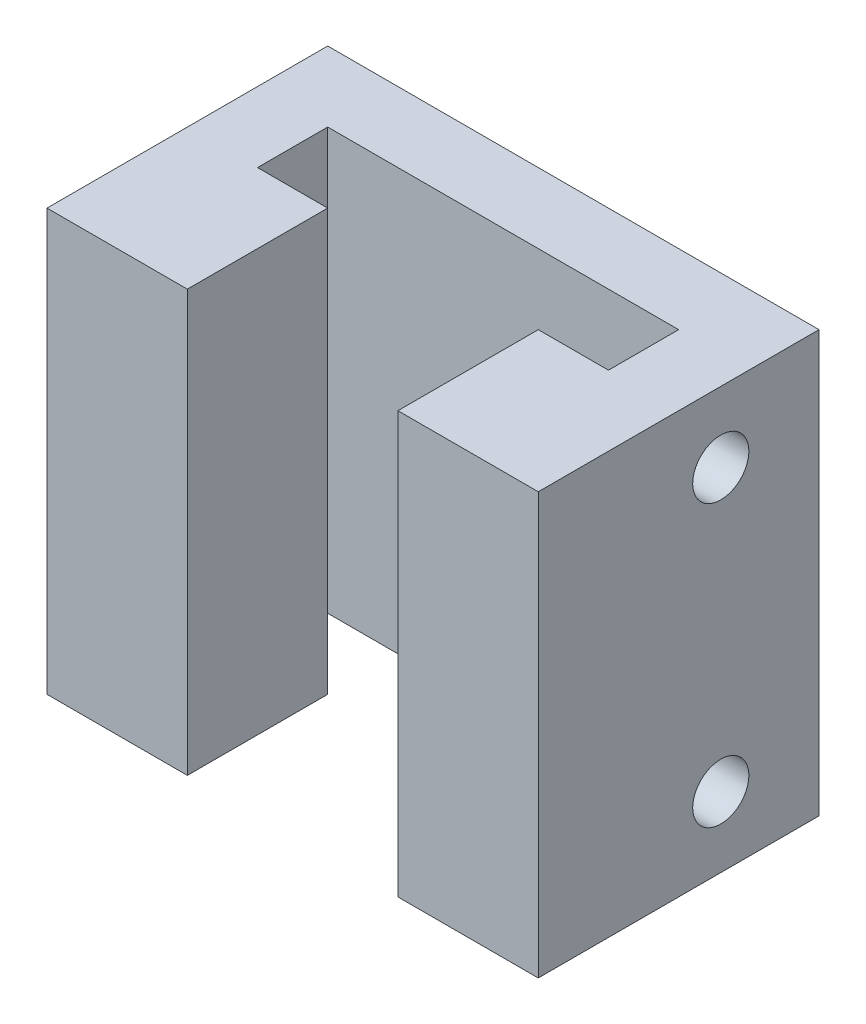
ISO-10303-21;
HEADER;
FILE_DESCRIPTION(('STEP AP214'),'2;1');
FILE_NAME('part.step','',(''),(''),'','','');
FILE_SCHEMA(('AUTOMOTIVE_DESIGN { 1 0 10303 214 1 1 1 1 }'));
ENDSEC;
DATA;
#1=APPLICATION_CONTEXT('core data for automotive mechanical design processes');
#2=APPLICATION_PROTOCOL_DEFINITION('international standard','automotive_design',2000,#1);
#3=PRODUCT_CONTEXT('',#1,'mechanical');
#4=PRODUCT('Part','Part','',(#3));
#5=PRODUCT_RELATED_PRODUCT_CATEGORY('part','',(#4));
#6=PRODUCT_DEFINITION_FORMATION('','',#4);
#7=PRODUCT_DEFINITION_CONTEXT('part definition',#1,'design');
#8=PRODUCT_DEFINITION('design','',#6,#7);
#9=PRODUCT_DEFINITION_SHAPE('','',#8);
#10=(LENGTH_UNIT() NAMED_UNIT(*) SI_UNIT(.MILLI.,.METRE.));
#11=(NAMED_UNIT(*) PLANE_ANGLE_UNIT() SI_UNIT($,.RADIAN.));
#12=(NAMED_UNIT(*) SI_UNIT($,.STERADIAN.) SOLID_ANGLE_UNIT());
#13=UNCERTAINTY_MEASURE_WITH_UNIT(LENGTH_MEASURE(1.E-05),#10,'distance_accuracy_value','');
#14=(GEOMETRIC_REPRESENTATION_CONTEXT(3) GLOBAL_UNCERTAINTY_ASSIGNED_CONTEXT((#13)) GLOBAL_UNIT_ASSIGNED_CONTEXT((#10,
#11,#12)) REPRESENTATION_CONTEXT('',''));
#15=CARTESIAN_POINT('',(0.,0.,0.));
#16=DIRECTION('',(0.,0.,1.));
#17=DIRECTION('',(1.,0.,0.));
#18=AXIS2_PLACEMENT_3D('',#15,#16,#17);
#19=CARTESIAN_POINT('',(0.,30.,-10.));
#20=DIRECTION('',(-1.,0.,0.));
#21=DIRECTION('',(0.,0.,1.));
#22=AXIS2_PLACEMENT_3D('',#19,#20,#21);
#23=PLANE('',#22);
#24=DIRECTION('',(0.,0.,-1.));
#25=VECTOR('',#24,1.);
#26=CARTESIAN_POINT('',(0.,0.,-10.));
#27=LINE('',#26,#25);
#28=CARTESIAN_POINT('',(0.,0.,0.));
#29=VERTEX_POINT('',#28);
#30=CARTESIAN_POINT('',(0.,0.,-10.));
#31=VERTEX_POINT('',#30);
#32=EDGE_CURVE('E158',#29,#31,#27,.T.);
#33=ORIENTED_EDGE('',*,*,#32,.T.);
#34=DIRECTION('',(0.,-1.,0.));
#35=VECTOR('',#34,1.);
#36=CARTESIAN_POINT('',(0.,30.,-10.));
#37=LINE('',#36,#35);
#38=CARTESIAN_POINT('',(0.,30.,-10.));
#39=VERTEX_POINT('',#38);
#40=EDGE_CURVE('E11',#39,#31,#37,.T.);
#41=ORIENTED_EDGE('',*,*,#40,.F.);
#42=DIRECTION('',(0.,0.,-1.));
#43=VECTOR('',#42,1.);
#44=CARTESIAN_POINT('',(0.,30.,-10.));
#45=LINE('',#44,#43);
#46=CARTESIAN_POINT('',(0.,30.,0.));
#47=VERTEX_POINT('',#46);
#48=EDGE_CURVE('E181',#47,#39,#45,.T.);
#49=ORIENTED_EDGE('',*,*,#48,.F.);
#50=DIRECTION('',(0.,-1.,0.));
#51=VECTOR('',#50,1.);
#52=CARTESIAN_POINT('',(0.,30.,0.));
#53=LINE('',#52,#51);
#54=EDGE_CURVE('E154',#47,#29,#53,.T.);
#55=ORIENTED_EDGE('',*,*,#54,.T.);
#56=EDGE_LOOP('',(#33,#41,#49,#55));
#57=FACE_BOUND('',#56,.T.);
#58=ADVANCED_FACE('F38',(#57),#23,.F.);
#59=CARTESIAN_POINT('',(0.,30.,-10.));
#60=DIRECTION('',(0.,0.,1.));
#61=DIRECTION('',(1.,0.,0.));
#62=AXIS2_PLACEMENT_3D('',#59,#60,#61);
#63=PLANE('',#62);
#64=DIRECTION('',(-1.,0.,0.));
#65=VECTOR('',#64,1.);
#66=CARTESIAN_POINT('',(0.,0.,-10.));
#67=LINE('',#66,#65);
#68=CARTESIAN_POINT('',(-5.,0.,-10.));
#69=VERTEX_POINT('',#68);
#70=EDGE_CURVE('E161',#31,#69,#67,.T.);
#71=ORIENTED_EDGE('',*,*,#70,.T.);
#72=DIRECTION('',(0.,-1.,0.));
#73=VECTOR('',#72,1.);
#74=CARTESIAN_POINT('',(-5.,30.,-10.));
#75=LINE('',#74,#73);
#76=CARTESIAN_POINT('',(-5.,30.,-10.));
#77=VERTEX_POINT('',#76);
#78=EDGE_CURVE('E46',#77,#69,#75,.T.);
#79=ORIENTED_EDGE('',*,*,#78,.F.);
#80=DIRECTION('',(-1.,0.,0.));
#81=VECTOR('',#80,1.);
#82=CARTESIAN_POINT('',(0.,30.,-10.));
#83=LINE('',#82,#81);
#84=EDGE_CURVE('E109',#39,#77,#83,.T.);
#85=ORIENTED_EDGE('',*,*,#84,.F.);
#86=ORIENTED_EDGE('',*,*,#40,.T.);
#87=EDGE_LOOP('',(#71,#79,#85,#86));
#88=FACE_BOUND('',#87,.T.);
#89=ADVANCED_FACE('F261',(#88),#63,.F.);
#90=CARTESIAN_POINT('',(-5.,30.,-10.));
#91=DIRECTION('',(-1.,0.,0.));
#92=DIRECTION('',(0.,0.,1.));
#93=AXIS2_PLACEMENT_3D('',#90,#91,#92);
#94=PLANE('',#93);
#95=DIRECTION('',(0.,0.,-1.));
#96=VECTOR('',#95,1.);
#97=CARTESIAN_POINT('',(-5.,0.,-10.));
#98=LINE('',#97,#96);
#99=CARTESIAN_POINT('',(-5.,0.,-15.));
#100=VERTEX_POINT('',#99);
#101=EDGE_CURVE('E164',#69,#100,#98,.T.);
#102=ORIENTED_EDGE('',*,*,#101,.T.);
#103=DIRECTION('',(0.,-1.,0.));
#104=VECTOR('',#103,1.);
#105=CARTESIAN_POINT('',(-5.,30.,-15.));
#106=LINE('',#105,#104);
#107=CARTESIAN_POINT('',(-5.,30.,-15.));
#108=VERTEX_POINT('',#107);
#109=EDGE_CURVE('E200',#108,#100,#106,.T.);
#110=ORIENTED_EDGE('',*,*,#109,.F.);
#111=DIRECTION('',(0.,0.,-1.));
#112=VECTOR('',#111,1.);
#113=CARTESIAN_POINT('',(-5.,30.,-10.));
#114=LINE('',#113,#112);
#115=EDGE_CURVE('E208',#77,#108,#114,.T.);
#116=ORIENTED_EDGE('',*,*,#115,.F.);
#117=ORIENTED_EDGE('',*,*,#78,.T.);
#118=EDGE_LOOP('',(#102,#110,#116,#117));
#119=FACE_BOUND('',#118,.T.);
#120=ADVANCED_FACE('F206',(#119),#94,.F.);
#121=CARTESIAN_POINT('',(-5.,30.,-15.));
#122=DIRECTION('',(0.,0.,-1.));
#123=DIRECTION('',(-1.,0.,0.));
#124=AXIS2_PLACEMENT_3D('',#121,#122,#123);
#125=PLANE('',#124);
#126=DIRECTION('',(1.,0.,0.));
#127=VECTOR('',#126,1.);
#128=CARTESIAN_POINT('',(-5.,0.,-15.));
#129=LINE('',#128,#127);
#130=CARTESIAN_POINT('',(20.,0.,-15.));
#131=VERTEX_POINT('',#130);
#132=EDGE_CURVE('E166',#100,#131,#129,.T.);
#133=ORIENTED_EDGE('',*,*,#132,.T.);
#134=DIRECTION('',(0.,-1.,0.));
#135=VECTOR('',#134,1.);
#136=CARTESIAN_POINT('',(20.,30.,-15.));
#137=LINE('',#136,#135);
#138=CARTESIAN_POINT('',(20.,30.,-15.));
#139=VERTEX_POINT('',#138);
#140=EDGE_CURVE('E197',#139,#131,#137,.T.);
#141=ORIENTED_EDGE('',*,*,#140,.F.);
#142=DIRECTION('',(1.,0.,0.));
#143=VECTOR('',#142,1.);
#144=CARTESIAN_POINT('',(-5.,30.,-15.));
#145=LINE('',#144,#143);
#146=EDGE_CURVE('E226',#108,#139,#145,.T.);
#147=ORIENTED_EDGE('',*,*,#146,.F.);
#148=ORIENTED_EDGE('',*,*,#109,.T.);
#149=EDGE_LOOP('',(#133,#141,#147,#148));
#150=FACE_BOUND('',#149,.T.);
#151=ADVANCED_FACE('F217',(#150),#125,.F.);
#152=CARTESIAN_POINT('',(20.,30.,-15.));
#153=DIRECTION('',(1.,0.,0.));
#154=DIRECTION('',(0.,0.,-1.));
#155=AXIS2_PLACEMENT_3D('',#152,#153,#154);
#156=PLANE('',#155);
#157=DIRECTION('',(0.,0.,1.));
#158=VECTOR('',#157,1.);
#159=CARTESIAN_POINT('',(20.,0.,-15.));
#160=LINE('',#159,#158);
#161=CARTESIAN_POINT('',(20.,0.,-10.));
#162=VERTEX_POINT('',#161);
#163=EDGE_CURVE('E168',#131,#162,#160,.T.);
#164=ORIENTED_EDGE('',*,*,#163,.T.);
#165=DIRECTION('',(0.,-1.,0.));
#166=VECTOR('',#165,1.);
#167=CARTESIAN_POINT('',(20.,30.,-10.));
#168=LINE('',#167,#166);
#169=CARTESIAN_POINT('',(20.,30.,-10.));
#170=VERTEX_POINT('',#169);
#171=EDGE_CURVE('E194',#170,#162,#168,.T.);
#172=ORIENTED_EDGE('',*,*,#171,.F.);
#173=DIRECTION('',(0.,0.,1.));
#174=VECTOR('',#173,1.);
#175=CARTESIAN_POINT('',(20.,30.,-15.));
#176=LINE('',#175,#174);
#177=EDGE_CURVE('E223',#139,#170,#176,.T.);
#178=ORIENTED_EDGE('',*,*,#177,.F.);
#179=ORIENTED_EDGE('',*,*,#140,.T.);
#180=EDGE_LOOP('',(#164,#172,#178,#179));
#181=FACE_BOUND('',#180,.T.);
#182=ADVANCED_FACE('F221',(#181),#156,.F.);
#183=CARTESIAN_POINT('',(20.,30.,-10.));
#184=DIRECTION('',(0.,0.,1.));
#185=DIRECTION('',(1.,0.,0.));
#186=AXIS2_PLACEMENT_3D('',#183,#184,#185);
#187=PLANE('',#186);
#188=DIRECTION('',(-1.,0.,0.));
#189=VECTOR('',#188,1.);
#190=CARTESIAN_POINT('',(20.,0.,-10.));
#191=LINE('',#190,#189);
#192=CARTESIAN_POINT('',(15.,0.,-10.));
#193=VERTEX_POINT('',#192);
#194=EDGE_CURVE('E170',#162,#193,#191,.T.);
#195=ORIENTED_EDGE('',*,*,#194,.T.);
#196=DIRECTION('',(0.,-1.,0.));
#197=VECTOR('',#196,1.);
#198=CARTESIAN_POINT('',(15.,30.,-10.));
#199=LINE('',#198,#197);
#200=CARTESIAN_POINT('',(15.,30.,-10.));
#201=VERTEX_POINT('',#200);
#202=EDGE_CURVE('E191',#201,#193,#199,.T.);
#203=ORIENTED_EDGE('',*,*,#202,.F.);
#204=DIRECTION('',(-1.,0.,0.));
#205=VECTOR('',#204,1.);
#206=CARTESIAN_POINT('',(20.,30.,-10.));
#207=LINE('',#206,#205);
#208=EDGE_CURVE('E225',#170,#201,#207,.T.);
#209=ORIENTED_EDGE('',*,*,#208,.F.);
#210=ORIENTED_EDGE('',*,*,#171,.T.);
#211=EDGE_LOOP('',(#195,#203,#209,#210));
#212=FACE_BOUND('',#211,.T.);
#213=ADVANCED_FACE('F274',(#212),#187,.F.);
#214=CARTESIAN_POINT('',(15.,30.,0.));
#215=DIRECTION('',(1.,0.,0.));
#216=DIRECTION('',(0.,0.,-1.));
#217=AXIS2_PLACEMENT_3D('',#214,#215,#216);
#218=PLANE('',#217);
#219=DIRECTION('',(0.,0.,1.));
#220=VECTOR('',#219,1.);
#221=CARTESIAN_POINT('',(15.,0.,0.));
#222=LINE('',#221,#220);
#223=CARTESIAN_POINT('',(15.,0.,0.));
#224=VERTEX_POINT('',#223);
#225=EDGE_CURVE('E172',#193,#224,#222,.T.);
#226=ORIENTED_EDGE('',*,*,#225,.T.);
#227=DIRECTION('',(0.,-1.,0.));
#228=VECTOR('',#227,1.);
#229=CARTESIAN_POINT('',(15.,30.,0.));
#230=LINE('',#229,#228);
#231=CARTESIAN_POINT('',(15.,30.,0.));
#232=VERTEX_POINT('',#231);
#233=EDGE_CURVE('E188',#232,#224,#230,.T.);
#234=ORIENTED_EDGE('',*,*,#233,.F.);
#235=DIRECTION('',(0.,0.,1.));
#236=VECTOR('',#235,1.);
#237=CARTESIAN_POINT('',(15.,30.,0.));
#238=LINE('',#237,#236);
#239=EDGE_CURVE('E228',#201,#232,#238,.T.);
#240=ORIENTED_EDGE('',*,*,#239,.F.);
#241=ORIENTED_EDGE('',*,*,#202,.T.);
#242=EDGE_LOOP('',(#226,#234,#240,#241));
#243=FACE_BOUND('',#242,.T.);
#244=ADVANCED_FACE('F277',(#243),#218,.F.);
#245=CARTESIAN_POINT('',(25.,30.,0.));
#246=DIRECTION('',(0.,0.,-1.));
#247=DIRECTION('',(-1.,0.,0.));
#248=AXIS2_PLACEMENT_3D('',#245,#246,#247);
#249=PLANE('',#248);
#250=DIRECTION('',(1.,0.,0.));
#251=VECTOR('',#250,1.);
#252=CARTESIAN_POINT('',(25.,0.,0.));
#253=LINE('',#252,#251);
#254=CARTESIAN_POINT('',(25.,0.,0.));
#255=VERTEX_POINT('',#254);
#256=EDGE_CURVE('E174',#224,#255,#253,.T.);
#257=ORIENTED_EDGE('',*,*,#256,.T.);
#258=DIRECTION('',(0.,-1.,0.));
#259=VECTOR('',#258,1.);
#260=CARTESIAN_POINT('',(25.,30.,0.));
#261=LINE('',#260,#259);
#262=CARTESIAN_POINT('',(25.,30.,0.));
#263=VERTEX_POINT('',#262);
#264=EDGE_CURVE('E185',#263,#255,#261,.T.);
#265=ORIENTED_EDGE('',*,*,#264,.F.);
#266=DIRECTION('',(1.,0.,0.));
#267=VECTOR('',#266,1.);
#268=CARTESIAN_POINT('',(25.,30.,0.));
#269=LINE('',#268,#267);
#270=EDGE_CURVE('E234',#232,#263,#269,.T.);
#271=ORIENTED_EDGE('',*,*,#270,.F.);
#272=ORIENTED_EDGE('',*,*,#233,.T.);
#273=EDGE_LOOP('',(#257,#265,#271,#272));
#274=FACE_BOUND('',#273,.T.);
#275=ADVANCED_FACE('F240',(#274),#249,.F.);
#276=CARTESIAN_POINT('',(25.,30.,-20.));
#277=DIRECTION('',(-1.,0.,0.));
#278=DIRECTION('',(0.,0.,1.));
#279=AXIS2_PLACEMENT_3D('',#276,#277,#278);
#280=PLANE('',#279);
#281=CARTESIAN_POINT('',(25.,25.,-13.));
#282=DIRECTION('',(-1.,0.,0.));
#283=DIRECTION('',(0.,0.,1.));
#284=AXIS2_PLACEMENT_3D('',#281,#282,#283);
#285=CIRCLE('',#284,2.);
#286=CARTESIAN_POINT('',(25.,25.,-11.));
#287=VERTEX_POINT('',#286);
#288=EDGE_CURVE('E466',#287,#287,#285,.T.);
#289=ORIENTED_EDGE('',*,*,#288,.T.);
#290=EDGE_LOOP('',(#289));
#291=FACE_BOUND('',#290,.T.);
#292=CARTESIAN_POINT('',(25.,5.,-13.));
#293=DIRECTION('',(-1.,0.,0.));
#294=DIRECTION('',(0.,0.,1.));
#295=AXIS2_PLACEMENT_3D('',#292,#293,#294);
#296=CIRCLE('',#295,2.);
#297=CARTESIAN_POINT('',(25.,5.,-11.));
#298=VERTEX_POINT('',#297);
#299=EDGE_CURVE('E453',#298,#298,#296,.T.);
#300=ORIENTED_EDGE('',*,*,#299,.T.);
#301=EDGE_LOOP('',(#300));
#302=FACE_BOUND('',#301,.T.);
#303=DIRECTION('',(0.,0.,-1.));
#304=VECTOR('',#303,1.);
#305=CARTESIAN_POINT('',(25.,0.,-20.));
#306=LINE('',#305,#304);
#307=CARTESIAN_POINT('',(25.,0.,-20.));
#308=VERTEX_POINT('',#307);
#309=EDGE_CURVE('E176',#255,#308,#306,.T.);
#310=ORIENTED_EDGE('',*,*,#309,.T.);
#311=DIRECTION('',(0.,-1.,0.));
#312=VECTOR('',#311,1.);
#313=CARTESIAN_POINT('',(25.,30.,-20.));
#314=LINE('',#313,#312);
#315=CARTESIAN_POINT('',(25.,30.,-20.));
#316=VERTEX_POINT('',#315);
#317=EDGE_CURVE('E149',#316,#308,#314,.T.);
#318=ORIENTED_EDGE('',*,*,#317,.F.);
#319=DIRECTION('',(0.,0.,-1.));
#320=VECTOR('',#319,1.);
#321=CARTESIAN_POINT('',(25.,30.,-20.));
#322=LINE('',#321,#320);
#323=EDGE_CURVE('E140',#263,#316,#322,.T.);
#324=ORIENTED_EDGE('',*,*,#323,.F.);
#325=ORIENTED_EDGE('',*,*,#264,.T.);
#326=EDGE_LOOP('',(#310,#318,#324,#325));
#327=FACE_BOUND('',#326,.T.);
#328=ADVANCED_FACE('F244',(#291,#302,#327),#280,.F.);
#329=CARTESIAN_POINT('',(-10.,30.,-20.));
#330=DIRECTION('',(0.,0.,1.));
#331=DIRECTION('',(1.,0.,0.));
#332=AXIS2_PLACEMENT_3D('',#329,#330,#331);
#333=PLANE('',#332);
#334=DIRECTION('',(-1.,0.,0.));
#335=VECTOR('',#334,1.);
#336=CARTESIAN_POINT('',(-10.,0.,-20.));
#337=LINE('',#336,#335);
#338=CARTESIAN_POINT('',(-10.,0.,-20.));
#339=VERTEX_POINT('',#338);
#340=EDGE_CURVE('E148',#308,#339,#337,.T.);
#341=ORIENTED_EDGE('',*,*,#340,.T.);
#342=DIRECTION('',(0.,-1.,0.));
#343=VECTOR('',#342,1.);
#344=CARTESIAN_POINT('',(-10.,30.,-20.));
#345=LINE('',#344,#343);
#346=CARTESIAN_POINT('',(-10.,30.,-20.));
#347=VERTEX_POINT('',#346);
#348=EDGE_CURVE('E145',#347,#339,#345,.T.);
#349=ORIENTED_EDGE('',*,*,#348,.F.);
#350=DIRECTION('',(-1.,0.,0.));
#351=VECTOR('',#350,1.);
#352=CARTESIAN_POINT('',(-10.,30.,-20.));
#353=LINE('',#352,#351);
#354=EDGE_CURVE('E134',#316,#347,#353,.T.);
#355=ORIENTED_EDGE('',*,*,#354,.F.);
#356=ORIENTED_EDGE('',*,*,#317,.T.);
#357=EDGE_LOOP('',(#341,#349,#355,#356));
#358=FACE_BOUND('',#357,.T.);
#359=ADVANCED_FACE('F146',(#358),#333,.F.);
#360=CARTESIAN_POINT('',(-10.,30.,0.));
#361=DIRECTION('',(1.,0.,0.));
#362=DIRECTION('',(0.,0.,-1.));
#363=AXIS2_PLACEMENT_3D('',#360,#361,#362);
#364=PLANE('',#363);
#365=CARTESIAN_POINT('',(-10.,25.,-13.));
#366=DIRECTION('',(-1.,0.,0.));
#367=DIRECTION('',(0.,0.,1.));
#368=AXIS2_PLACEMENT_3D('',#365,#366,#367);
#369=CIRCLE('',#368,2.);
#370=CARTESIAN_POINT('',(-10.,25.,-11.));
#371=VERTEX_POINT('',#370);
#372=EDGE_CURVE('E450',#371,#371,#369,.T.);
#373=ORIENTED_EDGE('',*,*,#372,.F.);
#374=EDGE_LOOP('',(#373));
#375=FACE_BOUND('',#374,.T.);
#376=CARTESIAN_POINT('',(-10.,5.,-13.));
#377=DIRECTION('',(-1.,0.,0.));
#378=DIRECTION('',(0.,0.,1.));
#379=AXIS2_PLACEMENT_3D('',#376,#377,#378);
#380=CIRCLE('',#379,2.);
#381=CARTESIAN_POINT('',(-10.,5.,-11.));
#382=VERTEX_POINT('',#381);
#383=EDGE_CURVE('E456',#382,#382,#380,.T.);
#384=ORIENTED_EDGE('',*,*,#383,.F.);
#385=EDGE_LOOP('',(#384));
#386=FACE_BOUND('',#385,.T.);
#387=DIRECTION('',(0.,0.,1.));
#388=VECTOR('',#387,1.);
#389=CARTESIAN_POINT('',(-10.,0.,0.));
#390=LINE('',#389,#388);
#391=CARTESIAN_POINT('',(-10.,0.,0.));
#392=VERTEX_POINT('',#391);
#393=EDGE_CURVE('E95',#339,#392,#390,.T.);
#394=ORIENTED_EDGE('',*,*,#393,.T.);
#395=DIRECTION('',(0.,-1.,0.));
#396=VECTOR('',#395,1.);
#397=CARTESIAN_POINT('',(-10.,30.,0.));
#398=LINE('',#397,#396);
#399=CARTESIAN_POINT('',(-10.,30.,0.));
#400=VERTEX_POINT('',#399);
#401=EDGE_CURVE('E150',#400,#392,#398,.T.);
#402=ORIENTED_EDGE('',*,*,#401,.F.);
#403=DIRECTION('',(0.,0.,1.));
#404=VECTOR('',#403,1.);
#405=CARTESIAN_POINT('',(-10.,30.,0.));
#406=LINE('',#405,#404);
#407=EDGE_CURVE('E138',#347,#400,#406,.T.);
#408=ORIENTED_EDGE('',*,*,#407,.F.);
#409=ORIENTED_EDGE('',*,*,#348,.T.);
#410=EDGE_LOOP('',(#394,#402,#408,#409));
#411=FACE_BOUND('',#410,.T.);
#412=ADVANCED_FACE('F152',(#375,#386,#411),#364,.F.);
#413=CARTESIAN_POINT('',(0.,30.,0.));
#414=DIRECTION('',(0.,0.,-1.));
#415=DIRECTION('',(-1.,0.,0.));
#416=AXIS2_PLACEMENT_3D('',#413,#414,#415);
#417=PLANE('',#416);
#418=DIRECTION('',(1.,0.,0.));
#419=VECTOR('',#418,1.);
#420=CARTESIAN_POINT('',(0.,0.,0.));
#421=LINE('',#420,#419);
#422=EDGE_CURVE('E101',#392,#29,#421,.T.);
#423=ORIENTED_EDGE('',*,*,#422,.T.);
#424=ORIENTED_EDGE('',*,*,#54,.F.);
#425=DIRECTION('',(1.,0.,0.));
#426=VECTOR('',#425,1.);
#427=CARTESIAN_POINT('',(0.,30.,0.));
#428=LINE('',#427,#426);
#429=EDGE_CURVE('E54',#400,#47,#428,.T.);
#430=ORIENTED_EDGE('',*,*,#429,.F.);
#431=ORIENTED_EDGE('',*,*,#401,.T.);
#432=EDGE_LOOP('',(#423,#424,#430,#431));
#433=FACE_BOUND('',#432,.T.);
#434=ADVANCED_FACE('F248',(#433),#417,.F.);
#435=CARTESIAN_POINT('',(0.,30.,0.));
#436=DIRECTION('',(0.,-1.,0.));
#437=DIRECTION('',(0.,0.,-1.));
#438=AXIS2_PLACEMENT_3D('',#435,#436,#437);
#439=PLANE('',#438);
#440=ORIENTED_EDGE('',*,*,#48,.T.);
#441=ORIENTED_EDGE('',*,*,#84,.T.);
#442=ORIENTED_EDGE('',*,*,#115,.T.);
#443=ORIENTED_EDGE('',*,*,#146,.T.);
#444=ORIENTED_EDGE('',*,*,#177,.T.);
#445=ORIENTED_EDGE('',*,*,#208,.T.);
#446=ORIENTED_EDGE('',*,*,#239,.T.);
#447=ORIENTED_EDGE('',*,*,#270,.T.);
#448=ORIENTED_EDGE('',*,*,#323,.T.);
#449=ORIENTED_EDGE('',*,*,#354,.T.);
#450=ORIENTED_EDGE('',*,*,#407,.T.);
#451=ORIENTED_EDGE('',*,*,#429,.T.);
#452=EDGE_LOOP('',(#440,#441,#442,#443,#444,#445,#446,#447,#448,#449,#450,#451));
#453=FACE_BOUND('',#452,.T.);
#454=ADVANCED_FACE('F136',(#453),#439,.F.);
#455=CARTESIAN_POINT('',(0.,0.,0.));
#456=DIRECTION('',(0.,-1.,0.));
#457=DIRECTION('',(0.,0.,-1.));
#458=AXIS2_PLACEMENT_3D('',#455,#456,#457);
#459=PLANE('',#458);
#460=ORIENTED_EDGE('',*,*,#32,.F.);
#461=ORIENTED_EDGE('',*,*,#422,.F.);
#462=ORIENTED_EDGE('',*,*,#393,.F.);
#463=ORIENTED_EDGE('',*,*,#340,.F.);
#464=ORIENTED_EDGE('',*,*,#309,.F.);
#465=ORIENTED_EDGE('',*,*,#256,.F.);
#466=ORIENTED_EDGE('',*,*,#225,.F.);
#467=ORIENTED_EDGE('',*,*,#194,.F.);
#468=ORIENTED_EDGE('',*,*,#163,.F.);
#469=ORIENTED_EDGE('',*,*,#132,.F.);
#470=ORIENTED_EDGE('',*,*,#101,.F.);
#471=ORIENTED_EDGE('',*,*,#70,.F.);
#472=EDGE_LOOP('',(#460,#461,#462,#463,#464,#465,#466,#467,#468,#469,#470,#471));
#473=FACE_BOUND('',#472,.T.);
#474=ADVANCED_FACE('F212',(#473),#459,.T.);
#475=CARTESIAN_POINT('',(22.,5.,-13.));
#476=DIRECTION('',(1.,0.,0.));
#477=DIRECTION('',(0.,0.,-1.));
#478=AXIS2_PLACEMENT_3D('',#475,#476,#477);
#479=CYLINDRICAL_SURFACE('',#478,2.);
#480=CARTESIAN_POINT('',(22.,5.,-13.));
#481=DIRECTION('',(-1.,0.,0.));
#482=DIRECTION('',(0.,0.,1.));
#483=AXIS2_PLACEMENT_3D('',#480,#481,#482);
#484=CIRCLE('',#483,2.);
#485=CARTESIAN_POINT('',(22.,5.,-11.));
#486=VERTEX_POINT('',#485);
#487=EDGE_CURVE('E449',#486,#486,#484,.T.);
#488=ORIENTED_EDGE('',*,*,#487,.T.);
#489=EDGE_LOOP('',(#488));
#490=FACE_BOUND('',#489,.T.);
#491=ORIENTED_EDGE('',*,*,#299,.F.);
#492=EDGE_LOOP('',(#491));
#493=FACE_BOUND('',#492,.T.);
#494=ADVANCED_FACE('F361',(#490,#493),#479,.F.);
#495=CARTESIAN_POINT('',(22.,5.,-13.));
#496=DIRECTION('',(-1.,0.,0.));
#497=DIRECTION('',(0.,0.,1.));
#498=AXIS2_PLACEMENT_3D('',#495,#496,#497);
#499=PLANE('',#498);
#500=ORIENTED_EDGE('',*,*,#487,.F.);
#501=EDGE_LOOP('',(#500));
#502=FACE_BOUND('',#501,.T.);
#503=ADVANCED_FACE('F368',(#502),#499,.F.);
#504=CARTESIAN_POINT('',(22.,25.,-13.));
#505=DIRECTION('',(1.,0.,0.));
#506=DIRECTION('',(0.,0.,-1.));
#507=AXIS2_PLACEMENT_3D('',#504,#505,#506);
#508=CYLINDRICAL_SURFACE('',#507,2.);
#509=CARTESIAN_POINT('',(22.,25.,-13.));
#510=DIRECTION('',(-1.,0.,0.));
#511=DIRECTION('',(0.,0.,1.));
#512=AXIS2_PLACEMENT_3D('',#509,#510,#511);
#513=CIRCLE('',#512,2.);
#514=CARTESIAN_POINT('',(22.,25.,-11.));
#515=VERTEX_POINT('',#514);
#516=EDGE_CURVE('E162',#515,#515,#513,.T.);
#517=ORIENTED_EDGE('',*,*,#516,.T.);
#518=EDGE_LOOP('',(#517));
#519=FACE_BOUND('',#518,.T.);
#520=ORIENTED_EDGE('',*,*,#288,.F.);
#521=EDGE_LOOP('',(#520));
#522=FACE_BOUND('',#521,.T.);
#523=ADVANCED_FACE('F377',(#519,#522),#508,.F.);
#524=CARTESIAN_POINT('',(22.,25.,-13.));
#525=DIRECTION('',(-1.,0.,0.));
#526=DIRECTION('',(0.,0.,1.));
#527=AXIS2_PLACEMENT_3D('',#524,#525,#526);
#528=PLANE('',#527);
#529=ORIENTED_EDGE('',*,*,#516,.F.);
#530=EDGE_LOOP('',(#529));
#531=FACE_BOUND('',#530,.T.);
#532=ADVANCED_FACE('F386',(#531),#528,.F.);
#533=CARTESIAN_POINT('',(-7.,5.,-13.));
#534=DIRECTION('',(-1.,0.,0.));
#535=DIRECTION('',(0.,0.,1.));
#536=AXIS2_PLACEMENT_3D('',#533,#534,#535);
#537=CYLINDRICAL_SURFACE('',#536,2.);
#538=CARTESIAN_POINT('',(-7.,5.,-13.));
#539=DIRECTION('',(-1.,0.,0.));
#540=DIRECTION('',(0.,0.,1.));
#541=AXIS2_PLACEMENT_3D('',#538,#539,#540);
#542=CIRCLE('',#541,2.);
#543=CARTESIAN_POINT('',(-7.,5.,-11.));
#544=VERTEX_POINT('',#543);
#545=EDGE_CURVE('E461',#544,#544,#542,.T.);
#546=ORIENTED_EDGE('',*,*,#545,.F.);
#547=EDGE_LOOP('',(#546));
#548=FACE_BOUND('',#547,.T.);
#549=ORIENTED_EDGE('',*,*,#383,.T.);
#550=EDGE_LOOP('',(#549));
#551=FACE_BOUND('',#550,.T.);
#552=ADVANCED_FACE('F395',(#548,#551),#537,.F.);
#553=CARTESIAN_POINT('',(-7.,5.,-13.));
#554=DIRECTION('',(-1.,0.,0.));
#555=DIRECTION('',(0.,0.,1.));
#556=AXIS2_PLACEMENT_3D('',#553,#554,#555);
#557=PLANE('',#556);
#558=ORIENTED_EDGE('',*,*,#545,.T.);
#559=EDGE_LOOP('',(#558));
#560=FACE_BOUND('',#559,.T.);
#561=ADVANCED_FACE('F404',(#560),#557,.T.);
#562=CARTESIAN_POINT('',(-7.,25.,-13.));
#563=DIRECTION('',(-1.,0.,0.));
#564=DIRECTION('',(0.,0.,1.));
#565=AXIS2_PLACEMENT_3D('',#562,#563,#564);
#566=CYLINDRICAL_SURFACE('',#565,2.);
#567=CARTESIAN_POINT('',(-7.,25.,-13.));
#568=DIRECTION('',(-1.,0.,0.));
#569=DIRECTION('',(0.,0.,1.));
#570=AXIS2_PLACEMENT_3D('',#567,#568,#569);
#571=CIRCLE('',#570,2.);
#572=CARTESIAN_POINT('',(-7.,25.,-11.));
#573=VERTEX_POINT('',#572);
#574=EDGE_CURVE('E448',#573,#573,#571,.T.);
#575=ORIENTED_EDGE('',*,*,#574,.F.);
#576=EDGE_LOOP('',(#575));
#577=FACE_BOUND('',#576,.T.);
#578=ORIENTED_EDGE('',*,*,#372,.T.);
#579=EDGE_LOOP('',(#578));
#580=FACE_BOUND('',#579,.T.);
#581=ADVANCED_FACE('F413',(#577,#580),#566,.F.);
#582=CARTESIAN_POINT('',(-7.,25.,-13.));
#583=DIRECTION('',(-1.,0.,0.));
#584=DIRECTION('',(0.,0.,1.));
#585=AXIS2_PLACEMENT_3D('',#582,#583,#584);
#586=PLANE('',#585);
#587=ORIENTED_EDGE('',*,*,#574,.T.);
#588=EDGE_LOOP('',(#587));
#589=FACE_BOUND('',#588,.T.);
#590=ADVANCED_FACE('F422',(#589),#586,.T.);
#591=CLOSED_SHELL('',(#58,#89,#120,#151,#182,#213,#244,#275,#328,#359,#412,#434,#454,#474,#494,
#503,#523,#532,#552,#561,#581,#590));
#592=MANIFOLD_SOLID_BREP('B2',#591);
#593=ADVANCED_BREP_SHAPE_REPRESENTATION('',(#18,#592),#14);
#594=SHAPE_DEFINITION_REPRESENTATION(#9,#593);
ENDSEC;
END-ISO-10303-21;
